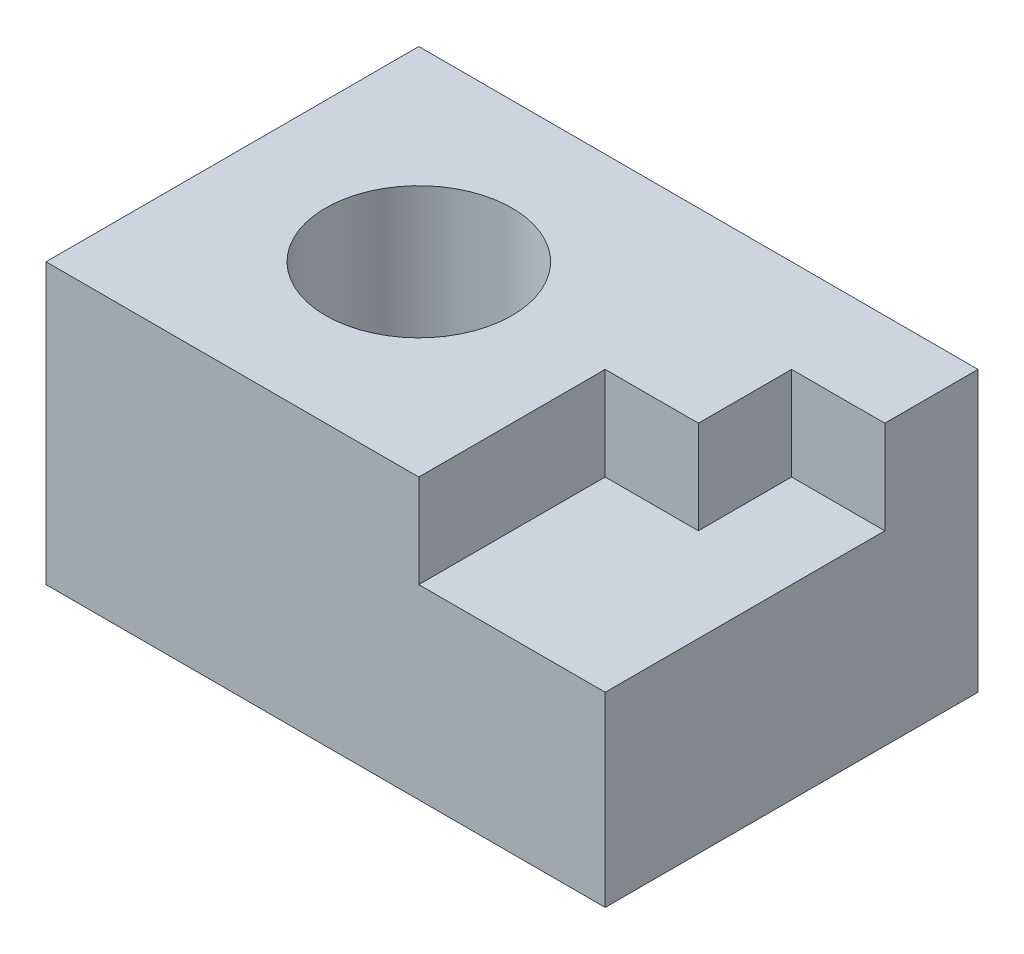
ISO-10303-21;
HEADER;
FILE_DESCRIPTION(('STEP AP214'),'2;1');
FILE_NAME('part.step','',(''),(''),'','','');
FILE_SCHEMA(('AUTOMOTIVE_DESIGN { 1 0 10303 214 1 1 1 1 }'));
ENDSEC;
DATA;
#1=APPLICATION_CONTEXT('core data for automotive mechanical design processes');
#2=APPLICATION_PROTOCOL_DEFINITION('international standard','automotive_design',2000,#1);
#3=PRODUCT_CONTEXT('',#1,'mechanical');
#4=PRODUCT('Part','Part','',(#3));
#5=PRODUCT_RELATED_PRODUCT_CATEGORY('part','',(#4));
#6=PRODUCT_DEFINITION_FORMATION('','',#4);
#7=PRODUCT_DEFINITION_CONTEXT('part definition',#1,'design');
#8=PRODUCT_DEFINITION('design','',#6,#7);
#9=PRODUCT_DEFINITION_SHAPE('','',#8);
#10=(LENGTH_UNIT() NAMED_UNIT(*) SI_UNIT(.MILLI.,.METRE.));
#11=(NAMED_UNIT(*) PLANE_ANGLE_UNIT() SI_UNIT($,.RADIAN.));
#12=(NAMED_UNIT(*) SI_UNIT($,.STERADIAN.) SOLID_ANGLE_UNIT());
#13=UNCERTAINTY_MEASURE_WITH_UNIT(LENGTH_MEASURE(1.E-05),#10,'distance_accuracy_value','');
#14=(GEOMETRIC_REPRESENTATION_CONTEXT(3) GLOBAL_UNCERTAINTY_ASSIGNED_CONTEXT((#13)) GLOBAL_UNIT_ASSIGNED_CONTEXT((#10,
#11,#12)) REPRESENTATION_CONTEXT('',''));
#15=CARTESIAN_POINT('',(0.,0.,0.));
#16=DIRECTION('',(0.,0.,1.));
#17=DIRECTION('',(1.,0.,0.));
#18=AXIS2_PLACEMENT_3D('',#15,#16,#17);
#19=CARTESIAN_POINT('',(0.,76.2,0.));
#20=DIRECTION('',(-1.,0.,0.));
#21=DIRECTION('',(0.,0.,1.));
#22=AXIS2_PLACEMENT_3D('',#19,#20,#21);
#23=PLANE('',#22);
#24=DIRECTION('',(0.,0.,-1.));
#25=VECTOR('',#24,1.);
#26=CARTESIAN_POINT('',(0.,0.,0.));
#27=LINE('',#26,#25);
#28=CARTESIAN_POINT('',(0.,0.,0.));
#29=VERTEX_POINT('',#28);
#30=CARTESIAN_POINT('',(0.,0.,-101.6));
#31=VERTEX_POINT('',#30);
#32=EDGE_CURVE('E158',#29,#31,#27,.T.);
#33=ORIENTED_EDGE('',*,*,#32,.F.);
#34=DIRECTION('',(0.,-1.,0.));
#35=VECTOR('',#34,1.);
#36=CARTESIAN_POINT('',(0.,76.2,0.));
#37=LINE('',#36,#35);
#38=CARTESIAN_POINT('',(0.,76.2,0.));
#39=VERTEX_POINT('',#38);
#40=EDGE_CURVE('E11',#39,#29,#37,.T.);
#41=ORIENTED_EDGE('',*,*,#40,.F.);
#42=DIRECTION('',(0.,0.,-1.));
#43=VECTOR('',#42,1.);
#44=CARTESIAN_POINT('',(0.,76.2,0.));
#45=LINE('',#44,#43);
#46=CARTESIAN_POINT('',(0.,76.2,-101.6));
#47=VERTEX_POINT('',#46);
#48=EDGE_CURVE('E150',#39,#47,#45,.T.);
#49=ORIENTED_EDGE('',*,*,#48,.T.);
#50=DIRECTION('',(0.,-1.,0.));
#51=VECTOR('',#50,1.);
#52=CARTESIAN_POINT('',(0.,76.2,-101.6));
#53=LINE('',#52,#51);
#54=EDGE_CURVE('E42',#47,#31,#53,.T.);
#55=ORIENTED_EDGE('',*,*,#54,.T.);
#56=EDGE_LOOP('',(#33,#41,#49,#55));
#57=FACE_BOUND('',#56,.T.);
#58=ADVANCED_FACE('F39',(#57),#23,.T.);
#59=CARTESIAN_POINT('',(0.,76.2,0.));
#60=DIRECTION('',(0.,0.,-1.));
#61=DIRECTION('',(-1.,0.,0.));
#62=AXIS2_PLACEMENT_3D('',#59,#60,#61);
#63=PLANE('',#62);
#64=DIRECTION('',(1.,0.,0.));
#65=VECTOR('',#64,1.);
#66=CARTESIAN_POINT('',(101.6,50.8,0.));
#67=LINE('',#66,#65);
#68=CARTESIAN_POINT('',(101.6,50.8,0.));
#69=VERTEX_POINT('',#68);
#70=CARTESIAN_POINT('',(152.4,50.8,0.));
#71=VERTEX_POINT('',#70);
#72=EDGE_CURVE('E120',#69,#71,#67,.T.);
#73=ORIENTED_EDGE('',*,*,#72,.F.);
#74=DIRECTION('',(0.,1.,0.));
#75=VECTOR('',#74,1.);
#76=CARTESIAN_POINT('',(101.6,50.8,0.));
#77=LINE('',#76,#75);
#78=CARTESIAN_POINT('',(101.6,76.2,0.));
#79=VERTEX_POINT('',#78);
#80=EDGE_CURVE('E162',#69,#79,#77,.T.);
#81=ORIENTED_EDGE('',*,*,#80,.T.);
#82=DIRECTION('',(1.,0.,0.));
#83=VECTOR('',#82,1.);
#84=CARTESIAN_POINT('',(0.,76.2,0.));
#85=LINE('',#84,#83);
#86=EDGE_CURVE('E163',#39,#79,#85,.T.);
#87=ORIENTED_EDGE('',*,*,#86,.F.);
#88=ORIENTED_EDGE('',*,*,#40,.T.);
#89=DIRECTION('',(1.,0.,0.));
#90=VECTOR('',#89,1.);
#91=CARTESIAN_POINT('',(0.,0.,0.));
#92=LINE('',#91,#90);
#93=CARTESIAN_POINT('',(152.4,0.,0.));
#94=VERTEX_POINT('',#93);
#95=EDGE_CURVE('E141',#29,#94,#92,.T.);
#96=ORIENTED_EDGE('',*,*,#95,.T.);
#97=DIRECTION('',(0.,-1.,0.));
#98=VECTOR('',#97,1.);
#99=CARTESIAN_POINT('',(152.4,76.2,0.));
#100=LINE('',#99,#98);
#101=EDGE_CURVE('E48',#71,#94,#100,.T.);
#102=ORIENTED_EDGE('',*,*,#101,.F.);
#103=EDGE_LOOP('',(#73,#81,#87,#88,#96,#102));
#104=FACE_BOUND('',#103,.T.);
#105=ADVANCED_FACE('F140',(#104),#63,.F.);
#106=CARTESIAN_POINT('',(152.4,76.2,0.));
#107=DIRECTION('',(-1.,0.,0.));
#108=DIRECTION('',(0.,0.,1.));
#109=AXIS2_PLACEMENT_3D('',#106,#107,#108);
#110=PLANE('',#109);
#111=DIRECTION('',(0.,0.,-1.));
#112=VECTOR('',#111,1.);
#113=CARTESIAN_POINT('',(152.4,76.2,0.));
#114=LINE('',#113,#112);
#115=CARTESIAN_POINT('',(152.4,76.2,-76.2));
#116=VERTEX_POINT('',#115);
#117=CARTESIAN_POINT('',(152.4,76.2,-101.6));
#118=VERTEX_POINT('',#117);
#119=EDGE_CURVE('E167',#116,#118,#114,.T.);
#120=ORIENTED_EDGE('',*,*,#119,.F.);
#121=DIRECTION('',(0.,1.,0.));
#122=VECTOR('',#121,1.);
#123=CARTESIAN_POINT('',(152.4,50.8,-76.2));
#124=LINE('',#123,#122);
#125=CARTESIAN_POINT('',(152.4,50.8,-76.2));
#126=VERTEX_POINT('',#125);
#127=EDGE_CURVE('E56',#126,#116,#124,.T.);
#128=ORIENTED_EDGE('',*,*,#127,.F.);
#129=DIRECTION('',(0.,0.,-1.));
#130=VECTOR('',#129,1.);
#131=CARTESIAN_POINT('',(152.4,50.8,0.));
#132=LINE('',#131,#130);
#133=EDGE_CURVE('E124',#71,#126,#132,.T.);
#134=ORIENTED_EDGE('',*,*,#133,.F.);
#135=ORIENTED_EDGE('',*,*,#101,.T.);
#136=DIRECTION('',(0.,0.,-1.));
#137=VECTOR('',#136,1.);
#138=CARTESIAN_POINT('',(152.4,0.,0.));
#139=LINE('',#138,#137);
#140=CARTESIAN_POINT('',(152.4,0.,-101.6));
#141=VERTEX_POINT('',#140);
#142=EDGE_CURVE('E151',#94,#141,#139,.T.);
#143=ORIENTED_EDGE('',*,*,#142,.T.);
#144=DIRECTION('',(0.,-1.,0.));
#145=VECTOR('',#144,1.);
#146=CARTESIAN_POINT('',(152.4,76.2,-101.6));
#147=LINE('',#146,#145);
#148=EDGE_CURVE('E144',#118,#141,#147,.T.);
#149=ORIENTED_EDGE('',*,*,#148,.F.);
#150=EDGE_LOOP('',(#120,#128,#134,#135,#143,#149));
#151=FACE_BOUND('',#150,.T.);
#152=ADVANCED_FACE('F135',(#151),#110,.F.);
#153=CARTESIAN_POINT('',(0.,76.2,-101.6));
#154=DIRECTION('',(0.,0.,-1.));
#155=DIRECTION('',(-1.,0.,0.));
#156=AXIS2_PLACEMENT_3D('',#153,#154,#155);
#157=PLANE('',#156);
#158=DIRECTION('',(1.,0.,0.));
#159=VECTOR('',#158,1.);
#160=CARTESIAN_POINT('',(0.,0.,-101.6));
#161=LINE('',#160,#159);
#162=EDGE_CURVE('E154',#31,#141,#161,.T.);
#163=ORIENTED_EDGE('',*,*,#162,.F.);
#164=ORIENTED_EDGE('',*,*,#54,.F.);
#165=DIRECTION('',(1.,0.,0.));
#166=VECTOR('',#165,1.);
#167=CARTESIAN_POINT('',(0.,76.2,-101.6));
#168=LINE('',#167,#166);
#169=EDGE_CURVE('E170',#47,#118,#168,.T.);
#170=ORIENTED_EDGE('',*,*,#169,.T.);
#171=ORIENTED_EDGE('',*,*,#148,.T.);
#172=EDGE_LOOP('',(#163,#164,#170,#171));
#173=FACE_BOUND('',#172,.T.);
#174=ADVANCED_FACE('F233',(#173),#157,.T.);
#175=CARTESIAN_POINT('',(0.,76.2,0.));
#176=DIRECTION('',(0.,-1.,0.));
#177=DIRECTION('',(0.,0.,-1.));
#178=AXIS2_PLACEMENT_3D('',#175,#176,#177);
#179=PLANE('',#178);
#180=CARTESIAN_POINT('',(50.8,76.2,-50.8));
#181=DIRECTION('',(0.,1.,0.));
#182=DIRECTION('',(0.,0.,1.));
#183=AXIS2_PLACEMENT_3D('',#180,#181,#182);
#184=CIRCLE('',#183,25.4);
#185=CARTESIAN_POINT('',(50.8,76.2,-25.4));
#186=VERTEX_POINT('',#185);
#187=EDGE_CURVE('E213',#186,#186,#184,.T.);
#188=ORIENTED_EDGE('',*,*,#187,.F.);
#189=EDGE_LOOP('',(#188));
#190=FACE_BOUND('',#189,.T.);
#191=ORIENTED_EDGE('',*,*,#86,.T.);
#192=DIRECTION('',(0.,0.,1.));
#193=VECTOR('',#192,1.);
#194=CARTESIAN_POINT('',(101.6,76.2,0.));
#195=LINE('',#194,#193);
#196=CARTESIAN_POINT('',(101.6,76.2,-50.8));
#197=VERTEX_POINT('',#196);
#198=EDGE_CURVE('E131',#197,#79,#195,.T.);
#199=ORIENTED_EDGE('',*,*,#198,.F.);
#200=DIRECTION('',(-1.,0.,0.));
#201=VECTOR('',#200,1.);
#202=CARTESIAN_POINT('',(101.6,76.2,-50.8));
#203=LINE('',#202,#201);
#204=CARTESIAN_POINT('',(127.,76.2,-50.8));
#205=VERTEX_POINT('',#204);
#206=EDGE_CURVE('E190',#205,#197,#203,.T.);
#207=ORIENTED_EDGE('',*,*,#206,.F.);
#208=DIRECTION('',(0.,0.,1.));
#209=VECTOR('',#208,1.);
#210=CARTESIAN_POINT('',(127.,76.2,-50.8));
#211=LINE('',#210,#209);
#212=CARTESIAN_POINT('',(127.,76.2,-76.2));
#213=VERTEX_POINT('',#212);
#214=EDGE_CURVE('E194',#213,#205,#211,.T.);
#215=ORIENTED_EDGE('',*,*,#214,.F.);
#216=DIRECTION('',(-1.,0.,0.));
#217=VECTOR('',#216,1.);
#218=CARTESIAN_POINT('',(127.,76.2,-76.2));
#219=LINE('',#218,#217);
#220=EDGE_CURVE('E198',#116,#213,#219,.T.);
#221=ORIENTED_EDGE('',*,*,#220,.F.);
#222=ORIENTED_EDGE('',*,*,#119,.T.);
#223=ORIENTED_EDGE('',*,*,#169,.F.);
#224=ORIENTED_EDGE('',*,*,#48,.F.);
#225=EDGE_LOOP('',(#191,#199,#207,#215,#221,#222,#223,#224));
#226=FACE_BOUND('',#225,.T.);
#227=ADVANCED_FACE('F230',(#190,#226),#179,.F.);
#228=CARTESIAN_POINT('',(0.,0.,0.));
#229=DIRECTION('',(0.,-1.,0.));
#230=DIRECTION('',(0.,0.,-1.));
#231=AXIS2_PLACEMENT_3D('',#228,#229,#230);
#232=PLANE('',#231);
#233=CARTESIAN_POINT('',(50.8,0.,-50.8));
#234=DIRECTION('',(0.,1.,0.));
#235=DIRECTION('',(0.,0.,1.));
#236=AXIS2_PLACEMENT_3D('',#233,#234,#235);
#237=CIRCLE('',#236,25.4);
#238=CARTESIAN_POINT('',(50.8,0.,-25.4));
#239=VERTEX_POINT('',#238);
#240=EDGE_CURVE('E201',#239,#239,#237,.T.);
#241=ORIENTED_EDGE('',*,*,#240,.T.);
#242=EDGE_LOOP('',(#241));
#243=FACE_BOUND('',#242,.T.);
#244=ORIENTED_EDGE('',*,*,#32,.T.);
#245=ORIENTED_EDGE('',*,*,#162,.T.);
#246=ORIENTED_EDGE('',*,*,#142,.F.);
#247=ORIENTED_EDGE('',*,*,#95,.F.);
#248=EDGE_LOOP('',(#244,#245,#246,#247));
#249=FACE_BOUND('',#248,.T.);
#250=ADVANCED_FACE('F221',(#243,#249),#232,.T.);
#251=CARTESIAN_POINT('',(101.6,50.8,0.));
#252=DIRECTION('',(-1.,0.,0.));
#253=DIRECTION('',(0.,0.,1.));
#254=AXIS2_PLACEMENT_3D('',#251,#252,#253);
#255=PLANE('',#254);
#256=ORIENTED_EDGE('',*,*,#198,.T.);
#257=ORIENTED_EDGE('',*,*,#80,.F.);
#258=DIRECTION('',(0.,0.,1.));
#259=VECTOR('',#258,1.);
#260=CARTESIAN_POINT('',(101.6,50.8,0.));
#261=LINE('',#260,#259);
#262=CARTESIAN_POINT('',(101.6,50.8,-50.8));
#263=VERTEX_POINT('',#262);
#264=EDGE_CURVE('E127',#263,#69,#261,.T.);
#265=ORIENTED_EDGE('',*,*,#264,.F.);
#266=DIRECTION('',(0.,1.,0.));
#267=VECTOR('',#266,1.);
#268=CARTESIAN_POINT('',(101.6,50.8,-50.8));
#269=LINE('',#268,#267);
#270=EDGE_CURVE('E183',#263,#197,#269,.T.);
#271=ORIENTED_EDGE('',*,*,#270,.T.);
#272=EDGE_LOOP('',(#256,#257,#265,#271));
#273=FACE_BOUND('',#272,.T.);
#274=ADVANCED_FACE('F239',(#273),#255,.F.);
#275=CARTESIAN_POINT('',(101.6,50.8,-50.8));
#276=DIRECTION('',(0.,0.,-1.));
#277=DIRECTION('',(-1.,0.,0.));
#278=AXIS2_PLACEMENT_3D('',#275,#276,#277);
#279=PLANE('',#278);
#280=ORIENTED_EDGE('',*,*,#206,.T.);
#281=ORIENTED_EDGE('',*,*,#270,.F.);
#282=DIRECTION('',(-1.,0.,0.));
#283=VECTOR('',#282,1.);
#284=CARTESIAN_POINT('',(101.6,50.8,-50.8));
#285=LINE('',#284,#283);
#286=CARTESIAN_POINT('',(127.,50.8,-50.8));
#287=VERTEX_POINT('',#286);
#288=EDGE_CURVE('E204',#287,#263,#285,.T.);
#289=ORIENTED_EDGE('',*,*,#288,.F.);
#290=DIRECTION('',(0.,1.,0.));
#291=VECTOR('',#290,1.);
#292=CARTESIAN_POINT('',(127.,50.8,-50.8));
#293=LINE('',#292,#291);
#294=EDGE_CURVE('E180',#287,#205,#293,.T.);
#295=ORIENTED_EDGE('',*,*,#294,.T.);
#296=EDGE_LOOP('',(#280,#281,#289,#295));
#297=FACE_BOUND('',#296,.T.);
#298=ADVANCED_FACE('F242',(#297),#279,.F.);
#299=CARTESIAN_POINT('',(127.,50.8,-50.8));
#300=DIRECTION('',(-1.,0.,0.));
#301=DIRECTION('',(0.,0.,1.));
#302=AXIS2_PLACEMENT_3D('',#299,#300,#301);
#303=PLANE('',#302);
#304=ORIENTED_EDGE('',*,*,#214,.T.);
#305=ORIENTED_EDGE('',*,*,#294,.F.);
#306=DIRECTION('',(0.,0.,1.));
#307=VECTOR('',#306,1.);
#308=CARTESIAN_POINT('',(127.,50.8,-50.8));
#309=LINE('',#308,#307);
#310=CARTESIAN_POINT('',(127.,50.8,-76.2));
#311=VERTEX_POINT('',#310);
#312=EDGE_CURVE('E207',#311,#287,#309,.T.);
#313=ORIENTED_EDGE('',*,*,#312,.F.);
#314=DIRECTION('',(0.,1.,0.));
#315=VECTOR('',#314,1.);
#316=CARTESIAN_POINT('',(127.,50.8,-76.2));
#317=LINE('',#316,#315);
#318=EDGE_CURVE('E177',#311,#213,#317,.T.);
#319=ORIENTED_EDGE('',*,*,#318,.T.);
#320=EDGE_LOOP('',(#304,#305,#313,#319));
#321=FACE_BOUND('',#320,.T.);
#322=ADVANCED_FACE('F245',(#321),#303,.F.);
#323=CARTESIAN_POINT('',(127.,50.8,-76.2));
#324=DIRECTION('',(0.,0.,-1.));
#325=DIRECTION('',(-1.,0.,0.));
#326=AXIS2_PLACEMENT_3D('',#323,#324,#325);
#327=PLANE('',#326);
#328=ORIENTED_EDGE('',*,*,#220,.T.);
#329=ORIENTED_EDGE('',*,*,#318,.F.);
#330=DIRECTION('',(-1.,0.,0.));
#331=VECTOR('',#330,1.);
#332=CARTESIAN_POINT('',(127.,50.8,-76.2));
#333=LINE('',#332,#331);
#334=EDGE_CURVE('E138',#126,#311,#333,.T.);
#335=ORIENTED_EDGE('',*,*,#334,.F.);
#336=ORIENTED_EDGE('',*,*,#127,.T.);
#337=EDGE_LOOP('',(#328,#329,#335,#336));
#338=FACE_BOUND('',#337,.T.);
#339=ADVANCED_FACE('F247',(#338),#327,.F.);
#340=CARTESIAN_POINT('',(0.,50.8,0.));
#341=DIRECTION('',(0.,1.,0.));
#342=DIRECTION('',(0.,0.,1.));
#343=AXIS2_PLACEMENT_3D('',#340,#341,#342);
#344=PLANE('',#343);
#345=ORIENTED_EDGE('',*,*,#72,.T.);
#346=ORIENTED_EDGE('',*,*,#133,.T.);
#347=ORIENTED_EDGE('',*,*,#334,.T.);
#348=ORIENTED_EDGE('',*,*,#312,.T.);
#349=ORIENTED_EDGE('',*,*,#288,.T.);
#350=ORIENTED_EDGE('',*,*,#264,.T.);
#351=EDGE_LOOP('',(#345,#346,#347,#348,#349,#350));
#352=FACE_BOUND('',#351,.T.);
#353=ADVANCED_FACE('F122',(#352),#344,.T.);
#354=CARTESIAN_POINT('',(50.8,0.,-50.8));
#355=DIRECTION('',(0.,1.,0.));
#356=DIRECTION('',(0.,0.,1.));
#357=AXIS2_PLACEMENT_3D('',#354,#355,#356);
#358=CYLINDRICAL_SURFACE('',#357,25.4);
#359=CARTESIAN_POINT('',(50.8,0.,-25.4));
#360=CARTESIAN_POINT('',(50.8,0.79375,-25.4));
#361=CARTESIAN_POINT('',(50.8,1.5875,-25.4));
#362=CARTESIAN_POINT('',(50.8,3.175,-25.4));
#363=CARTESIAN_POINT('',(50.8,3.96875,-25.4));
#364=CARTESIAN_POINT('',(50.8,5.55625,-25.4));
#365=CARTESIAN_POINT('',(50.8,6.35,-25.4));
#366=CARTESIAN_POINT('',(50.8,7.9375,-25.4));
#367=CARTESIAN_POINT('',(50.8,8.73125,-25.4));
#368=CARTESIAN_POINT('',(50.8,10.31875,-25.4));
#369=CARTESIAN_POINT('',(50.8,11.1125,-25.4));
#370=CARTESIAN_POINT('',(50.8,12.7,-25.4));
#371=CARTESIAN_POINT('',(50.8,13.49375,-25.4));
#372=CARTESIAN_POINT('',(50.8,15.08125,-25.4));
#373=CARTESIAN_POINT('',(50.8,15.875,-25.4));
#374=CARTESIAN_POINT('',(50.8,17.4625,-25.4));
#375=CARTESIAN_POINT('',(50.8,18.25625,-25.4));
#376=CARTESIAN_POINT('',(50.8,19.84375,-25.4));
#377=CARTESIAN_POINT('',(50.8,20.6375,-25.4));
#378=CARTESIAN_POINT('',(50.8,22.225,-25.4));
#379=CARTESIAN_POINT('',(50.8,23.01875,-25.4));
#380=CARTESIAN_POINT('',(50.8,24.60625,-25.4));
#381=CARTESIAN_POINT('',(50.8,25.4,-25.4));
#382=CARTESIAN_POINT('',(50.8,26.9875,-25.4));
#383=CARTESIAN_POINT('',(50.8,27.78125,-25.4));
#384=CARTESIAN_POINT('',(50.8,29.36875,-25.4));
#385=CARTESIAN_POINT('',(50.8,30.1625,-25.4));
#386=CARTESIAN_POINT('',(50.8,31.75,-25.4));
#387=CARTESIAN_POINT('',(50.8,32.54375,-25.4));
#388=CARTESIAN_POINT('',(50.8,34.13125,-25.4));
#389=CARTESIAN_POINT('',(50.8,34.925,-25.4));
#390=CARTESIAN_POINT('',(50.8,36.5125,-25.4));
#391=CARTESIAN_POINT('',(50.8,37.30625,-25.4));
#392=CARTESIAN_POINT('',(50.8,38.89375,-25.4));
#393=CARTESIAN_POINT('',(50.8,39.6875,-25.4));
#394=CARTESIAN_POINT('',(50.8,41.275,-25.4));
#395=CARTESIAN_POINT('',(50.8,42.06875,-25.4));
#396=CARTESIAN_POINT('',(50.8,43.65625,-25.4));
#397=CARTESIAN_POINT('',(50.8,44.45,-25.4));
#398=CARTESIAN_POINT('',(50.8,46.0375,-25.4));
#399=CARTESIAN_POINT('',(50.8,46.83125,-25.4));
#400=CARTESIAN_POINT('',(50.8,48.41875,-25.4));
#401=CARTESIAN_POINT('',(50.8,49.2125,-25.4));
#402=CARTESIAN_POINT('',(50.8,50.8,-25.4));
#403=CARTESIAN_POINT('',(50.8,51.59375,-25.4));
#404=CARTESIAN_POINT('',(50.8,53.18125,-25.4));
#405=CARTESIAN_POINT('',(50.8,53.975,-25.4));
#406=CARTESIAN_POINT('',(50.8,55.5625,-25.4));
#407=CARTESIAN_POINT('',(50.8,56.35625,-25.4));
#408=CARTESIAN_POINT('',(50.8,57.94375,-25.4));
#409=CARTESIAN_POINT('',(50.8,58.7375,-25.4));
#410=CARTESIAN_POINT('',(50.8,60.325,-25.4));
#411=CARTESIAN_POINT('',(50.8,61.11875,-25.4));
#412=CARTESIAN_POINT('',(50.8,62.70625,-25.4));
#413=CARTESIAN_POINT('',(50.8,63.5,-25.4));
#414=CARTESIAN_POINT('',(50.8,65.0875,-25.4));
#415=CARTESIAN_POINT('',(50.8,65.88125,-25.4));
#416=CARTESIAN_POINT('',(50.8,67.46875,-25.4));
#417=CARTESIAN_POINT('',(50.8,68.2625,-25.4));
#418=CARTESIAN_POINT('',(50.8,69.85,-25.4));
#419=CARTESIAN_POINT('',(50.8,70.64375,-25.4));
#420=CARTESIAN_POINT('',(50.8,72.23125,-25.4));
#421=CARTESIAN_POINT('',(50.8,73.025,-25.4));
#422=CARTESIAN_POINT('',(50.8,74.6125,-25.4));
#423=CARTESIAN_POINT('',(50.8,75.40625,-25.4));
#424=CARTESIAN_POINT('',(50.8,76.2,-25.4));
#425=B_SPLINE_CURVE_WITH_KNOTS('',3,(#359,#360,#361,#362,#363,#364,#365,#366,#367,#368,#369,
#370,#371,#372,#373,#374,#375,#376,#377,#378,#379,#380,#381,#382,#383,#384,#385,#386,#387,#388,
#389,#390,#391,#392,#393,#394,#395,#396,#397,#398,#399,#400,#401,#402,#403,#404,#405,#406,#407,
#408,#409,#410,#411,#412,#413,#414,#415,#416,#417,#418,#419,#420,#421,#422,#423,#424),
.UNSPECIFIED.,.F.,.F.,(4,2,2,2,2,2,2,2,2,2,2,2,2,2,2,2,2,2,2,2,2,2,2,2,2,2,2,2,2,2,2,2,4),(0.,
2.38125,4.7625,7.14375,9.525,11.90625,14.2875,16.66875,19.05,21.43125,23.8125,26.19375,28.575,
30.95625,33.3375,35.71875,38.1,40.48125,42.8625,45.24375,47.625,50.00625,52.3875,54.76875,57.15,
59.53125,61.9125,64.29375,66.675,69.05625,71.4375,73.81875,76.2),.UNSPECIFIED.);
#426=EDGE_CURVE('BSEAM224',#239,#186,#425,.T.);
#427=ORIENTED_EDGE('',*,*,#240,.F.);
#428=ORIENTED_EDGE('',*,*,#187,.T.);
#429=ORIENTED_EDGE('',*,*,#426,.T.);
#430=ORIENTED_EDGE('',*,*,#426,.F.);
#431=EDGE_LOOP('',(#427,#429,#428,#430));
#432=FACE_BOUND('',#431,.T.);
#433=ADVANCED_FACE('F224',(#432),#358,.F.);
#434=CLOSED_SHELL('',(#58,#105,#152,#174,#227,#250,#274,#298,#322,#339,#353,#433));
#435=MANIFOLD_SOLID_BREP('B2',#434);
#436=ADVANCED_BREP_SHAPE_REPRESENTATION('',(#18,#435),#14);
#437=SHAPE_DEFINITION_REPRESENTATION(#9,#436);
ENDSEC;
END-ISO-10303-21;
